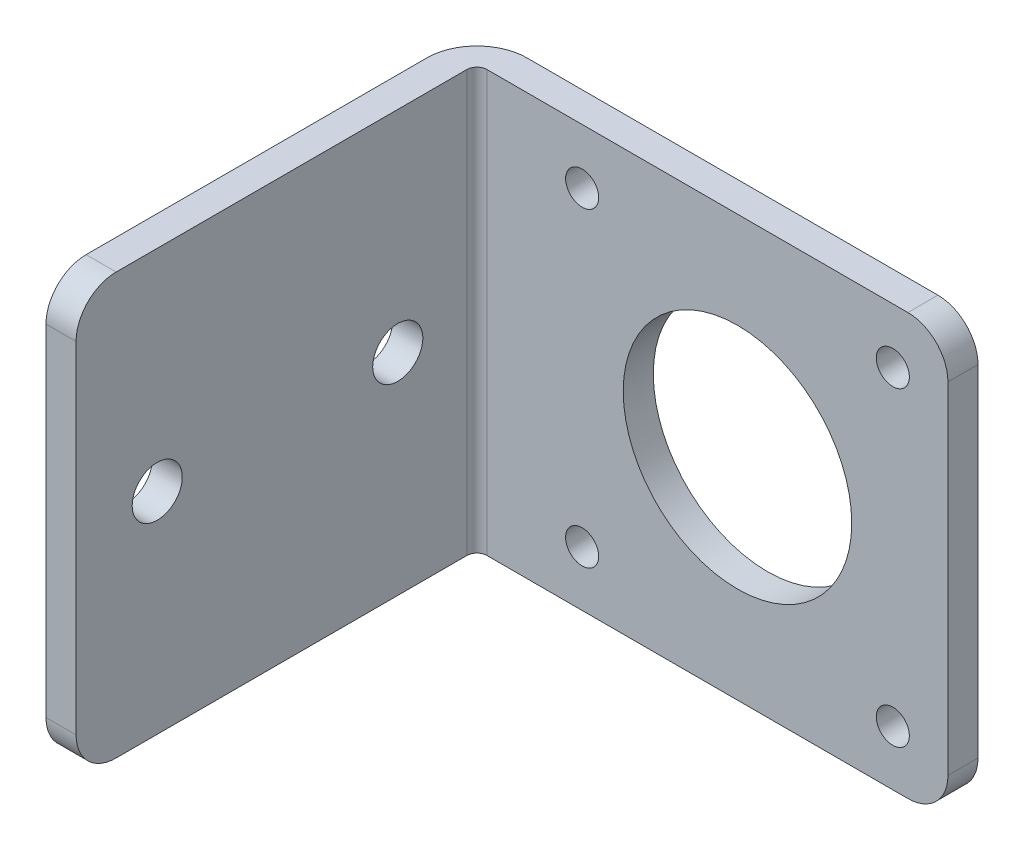
ISO-10303-21;
HEADER;
FILE_DESCRIPTION(('STEP AP214'),'2;1');
FILE_NAME('part.step','',(''),(''),'','','');
FILE_SCHEMA(('AUTOMOTIVE_DESIGN { 1 0 10303 214 1 1 1 1 }'));
ENDSEC;
DATA;
#1=APPLICATION_CONTEXT('core data for automotive mechanical design processes');
#2=APPLICATION_PROTOCOL_DEFINITION('international standard','automotive_design',2000,#1);
#3=PRODUCT_CONTEXT('',#1,'mechanical');
#4=PRODUCT('Part','Part','',(#3));
#5=PRODUCT_RELATED_PRODUCT_CATEGORY('part','',(#4));
#6=PRODUCT_DEFINITION_FORMATION('','',#4);
#7=PRODUCT_DEFINITION_CONTEXT('part definition',#1,'design');
#8=PRODUCT_DEFINITION('design','',#6,#7);
#9=PRODUCT_DEFINITION_SHAPE('','',#8);
#10=(LENGTH_UNIT() NAMED_UNIT(*) SI_UNIT(.MILLI.,.METRE.));
#11=(NAMED_UNIT(*) PLANE_ANGLE_UNIT() SI_UNIT($,.RADIAN.));
#12=(NAMED_UNIT(*) SI_UNIT($,.STERADIAN.) SOLID_ANGLE_UNIT());
#13=UNCERTAINTY_MEASURE_WITH_UNIT(LENGTH_MEASURE(1.E-05),#10,'distance_accuracy_value','');
#14=(GEOMETRIC_REPRESENTATION_CONTEXT(3) GLOBAL_UNCERTAINTY_ASSIGNED_CONTEXT((#13)) GLOBAL_UNIT_ASSIGNED_CONTEXT((#10,
#11,#12)) REPRESENTATION_CONTEXT('',''));
#15=CARTESIAN_POINT('',(0.,0.,0.));
#16=DIRECTION('',(0.,0.,1.));
#17=DIRECTION('',(1.,0.,0.));
#18=AXIS2_PLACEMENT_3D('',#15,#16,#17);
#19=CARTESIAN_POINT('',(0.,0.,34.9));
#20=DIRECTION('',(1.,0.,0.));
#21=DIRECTION('',(0.,0.,-1.));
#22=AXIS2_PLACEMENT_3D('',#19,#20,#21);
#23=CYLINDRICAL_SURFACE('',#22,2.5);
#24=CARTESIAN_POINT('',(0.,0.,34.9));
#25=DIRECTION('',(1.,0.,0.));
#26=DIRECTION('',(0.,0.,-1.));
#27=AXIS2_PLACEMENT_3D('',#24,#25,#26);
#28=CIRCLE('',#27,2.5);
#29=CARTESIAN_POINT('',(0.,0.,37.4));
#30=VERTEX_POINT('',#29);
#31=EDGE_CURVE('E40',#30,#30,#28,.T.);
#32=ORIENTED_EDGE('',*,*,#31,.F.);
#33=DIRECTION('',(1.,0.,0.));
#34=VECTOR('',#33,1.);
#35=CARTESIAN_POINT('',(0.,0.,37.4));
#36=LINE('',#35,#34);
#37=CARTESIAN_POINT('',(3.,0.,37.4));
#38=VERTEX_POINT('',#37);
#39=EDGE_CURVE('E11',#30,#38,#36,.T.);
#40=ORIENTED_EDGE('',*,*,#39,.T.);
#41=CARTESIAN_POINT('',(3.,0.,34.9));
#42=DIRECTION('',(1.,0.,0.));
#43=DIRECTION('',(0.,0.,-1.));
#44=AXIS2_PLACEMENT_3D('',#41,#42,#43);
#45=CIRCLE('',#44,2.5);
#46=EDGE_CURVE('E27',#38,#38,#45,.T.);
#47=ORIENTED_EDGE('',*,*,#46,.T.);
#48=ORIENTED_EDGE('',*,*,#39,.F.);
#49=EDGE_LOOP('',(#32,#40,#47,#48));
#50=FACE_BOUND('',#49,.T.);
#51=ADVANCED_FACE('F16',(#50),#23,.F.);
#52=CARTESIAN_POINT('',(0.,0.,10.9));
#53=DIRECTION('',(1.,0.,0.));
#54=DIRECTION('',(0.,0.,-1.));
#55=AXIS2_PLACEMENT_3D('',#52,#53,#54);
#56=CYLINDRICAL_SURFACE('',#55,2.5);
#57=CARTESIAN_POINT('',(0.,0.,10.9));
#58=DIRECTION('',(1.,0.,0.));
#59=DIRECTION('',(0.,0.,-1.));
#60=AXIS2_PLACEMENT_3D('',#57,#58,#59);
#61=CIRCLE('',#60,2.5);
#62=CARTESIAN_POINT('',(0.,0.,13.4));
#63=VERTEX_POINT('',#62);
#64=EDGE_CURVE('E142',#63,#63,#61,.T.);
#65=ORIENTED_EDGE('',*,*,#64,.F.);
#66=DIRECTION('',(1.,0.,0.));
#67=VECTOR('',#66,1.);
#68=CARTESIAN_POINT('',(0.,0.,13.4));
#69=LINE('',#68,#67);
#70=CARTESIAN_POINT('',(3.,0.,13.4));
#71=VERTEX_POINT('',#70);
#72=EDGE_CURVE('E145',#63,#71,#69,.T.);
#73=ORIENTED_EDGE('',*,*,#72,.T.);
#74=CARTESIAN_POINT('',(3.,0.,10.9));
#75=DIRECTION('',(1.,0.,0.));
#76=DIRECTION('',(0.,0.,-1.));
#77=AXIS2_PLACEMENT_3D('',#74,#75,#76);
#78=CIRCLE('',#77,2.5);
#79=EDGE_CURVE('E164',#71,#71,#78,.T.);
#80=ORIENTED_EDGE('',*,*,#79,.T.);
#81=ORIENTED_EDGE('',*,*,#72,.F.);
#82=EDGE_LOOP('',(#65,#73,#80,#81));
#83=FACE_BOUND('',#82,.T.);
#84=ADVANCED_FACE('F143',(#83),#56,.F.);
#85=CARTESIAN_POINT('',(44.5,-15.5,0.));
#86=DIRECTION('',(0.,0.,1.));
#87=DIRECTION('',(1.,0.,0.));
#88=AXIS2_PLACEMENT_3D('',#85,#86,#87);
#89=CYLINDRICAL_SURFACE('',#88,1.65);
#90=CARTESIAN_POINT('',(44.5,-15.5,0.));
#91=DIRECTION('',(0.,0.,1.));
#92=DIRECTION('',(1.,0.,0.));
#93=AXIS2_PLACEMENT_3D('',#90,#91,#92);
#94=CIRCLE('',#93,1.65);
#95=CARTESIAN_POINT('',(42.85,-15.5,0.));
#96=VERTEX_POINT('',#95);
#97=EDGE_CURVE('E253',#96,#96,#94,.T.);
#98=ORIENTED_EDGE('',*,*,#97,.F.);
#99=DIRECTION('',(0.,0.,1.));
#100=VECTOR('',#99,1.);
#101=CARTESIAN_POINT('',(42.85,-15.5,0.));
#102=LINE('',#101,#100);
#103=CARTESIAN_POINT('',(42.85,-15.5,3.));
#104=VERTEX_POINT('',#103);
#105=EDGE_CURVE('E244',#96,#104,#102,.T.);
#106=ORIENTED_EDGE('',*,*,#105,.T.);
#107=CARTESIAN_POINT('',(44.5,-15.5,3.));
#108=DIRECTION('',(0.,0.,1.));
#109=DIRECTION('',(1.,0.,0.));
#110=AXIS2_PLACEMENT_3D('',#107,#108,#109);
#111=CIRCLE('',#110,1.65);
#112=EDGE_CURVE('E248',#104,#104,#111,.T.);
#113=ORIENTED_EDGE('',*,*,#112,.T.);
#114=ORIENTED_EDGE('',*,*,#105,.F.);
#115=EDGE_LOOP('',(#98,#106,#113,#114));
#116=FACE_BOUND('',#115,.T.);
#117=ADVANCED_FACE('F492',(#116),#89,.F.);
#118=CARTESIAN_POINT('',(13.5,-15.5,0.));
#119=DIRECTION('',(0.,0.,1.));
#120=DIRECTION('',(1.,0.,0.));
#121=AXIS2_PLACEMENT_3D('',#118,#119,#120);
#122=CYLINDRICAL_SURFACE('',#121,1.65);
#123=CARTESIAN_POINT('',(13.5,-15.5,0.));
#124=DIRECTION('',(0.,0.,1.));
#125=DIRECTION('',(1.,0.,0.));
#126=AXIS2_PLACEMENT_3D('',#123,#124,#125);
#127=CIRCLE('',#126,1.65);
#128=CARTESIAN_POINT('',(11.85,-15.5,0.));
#129=VERTEX_POINT('',#128);
#130=EDGE_CURVE('E314',#129,#129,#127,.T.);
#131=ORIENTED_EDGE('',*,*,#130,.F.);
#132=DIRECTION('',(0.,0.,1.));
#133=VECTOR('',#132,1.);
#134=CARTESIAN_POINT('',(11.85,-15.5,0.));
#135=LINE('',#134,#133);
#136=CARTESIAN_POINT('',(11.85,-15.5,3.));
#137=VERTEX_POINT('',#136);
#138=EDGE_CURVE('E197',#129,#137,#135,.T.);
#139=ORIENTED_EDGE('',*,*,#138,.T.);
#140=CARTESIAN_POINT('',(13.5,-15.5,3.));
#141=DIRECTION('',(0.,0.,1.));
#142=DIRECTION('',(1.,0.,0.));
#143=AXIS2_PLACEMENT_3D('',#140,#141,#142);
#144=CIRCLE('',#143,1.65);
#145=EDGE_CURVE('E181',#137,#137,#144,.T.);
#146=ORIENTED_EDGE('',*,*,#145,.T.);
#147=ORIENTED_EDGE('',*,*,#138,.F.);
#148=EDGE_LOOP('',(#131,#139,#146,#147));
#149=FACE_BOUND('',#148,.T.);
#150=ADVANCED_FACE('F364',(#149),#122,.F.);
#151=CARTESIAN_POINT('',(44.5,15.5,0.));
#152=DIRECTION('',(0.,0.,1.));
#153=DIRECTION('',(1.,0.,0.));
#154=AXIS2_PLACEMENT_3D('',#151,#152,#153);
#155=CYLINDRICAL_SURFACE('',#154,1.65);
#156=CARTESIAN_POINT('',(44.5,15.5,0.));
#157=DIRECTION('',(0.,0.,1.));
#158=DIRECTION('',(1.,0.,0.));
#159=AXIS2_PLACEMENT_3D('',#156,#157,#158);
#160=CIRCLE('',#159,1.65);
#161=CARTESIAN_POINT('',(42.85,15.5,0.));
#162=VERTEX_POINT('',#161);
#163=EDGE_CURVE('E227',#162,#162,#160,.T.);
#164=ORIENTED_EDGE('',*,*,#163,.F.);
#165=DIRECTION('',(0.,0.,1.));
#166=VECTOR('',#165,1.);
#167=CARTESIAN_POINT('',(42.85,15.5,0.));
#168=LINE('',#167,#166);
#169=CARTESIAN_POINT('',(42.85,15.5,3.));
#170=VERTEX_POINT('',#169);
#171=EDGE_CURVE('E177',#162,#170,#168,.T.);
#172=ORIENTED_EDGE('',*,*,#171,.T.);
#173=CARTESIAN_POINT('',(44.5,15.5,3.));
#174=DIRECTION('',(0.,0.,1.));
#175=DIRECTION('',(1.,0.,0.));
#176=AXIS2_PLACEMENT_3D('',#173,#174,#175);
#177=CIRCLE('',#176,1.65);
#178=EDGE_CURVE('E182',#170,#170,#177,.T.);
#179=ORIENTED_EDGE('',*,*,#178,.T.);
#180=ORIENTED_EDGE('',*,*,#171,.F.);
#181=EDGE_LOOP('',(#164,#172,#179,#180));
#182=FACE_BOUND('',#181,.T.);
#183=ADVANCED_FACE('F512',(#182),#155,.F.);
#184=CARTESIAN_POINT('',(13.5,15.5,0.));
#185=DIRECTION('',(0.,0.,1.));
#186=DIRECTION('',(1.,0.,0.));
#187=AXIS2_PLACEMENT_3D('',#184,#185,#186);
#188=CYLINDRICAL_SURFACE('',#187,1.65);
#189=CARTESIAN_POINT('',(13.5,15.5,0.));
#190=DIRECTION('',(0.,0.,1.));
#191=DIRECTION('',(1.,0.,0.));
#192=AXIS2_PLACEMENT_3D('',#189,#190,#191);
#193=CIRCLE('',#192,1.65);
#194=CARTESIAN_POINT('',(11.85,15.5,0.));
#195=VERTEX_POINT('',#194);
#196=EDGE_CURVE('E187',#195,#195,#193,.T.);
#197=ORIENTED_EDGE('',*,*,#196,.F.);
#198=DIRECTION('',(0.,0.,1.));
#199=VECTOR('',#198,1.);
#200=CARTESIAN_POINT('',(11.85,15.5,0.));
#201=LINE('',#200,#199);
#202=CARTESIAN_POINT('',(11.85,15.5,3.));
#203=VERTEX_POINT('',#202);
#204=EDGE_CURVE('E280',#195,#203,#201,.T.);
#205=ORIENTED_EDGE('',*,*,#204,.T.);
#206=CARTESIAN_POINT('',(13.5,15.5,3.));
#207=DIRECTION('',(0.,0.,1.));
#208=DIRECTION('',(1.,0.,0.));
#209=AXIS2_PLACEMENT_3D('',#206,#207,#208);
#210=CIRCLE('',#209,1.65);
#211=EDGE_CURVE('E276',#203,#203,#210,.T.);
#212=ORIENTED_EDGE('',*,*,#211,.T.);
#213=ORIENTED_EDGE('',*,*,#204,.F.);
#214=EDGE_LOOP('',(#197,#205,#212,#213));
#215=FACE_BOUND('',#214,.T.);
#216=ADVANCED_FACE('F514',(#215),#188,.F.);
#217=CARTESIAN_POINT('',(29.,0.,0.));
#218=DIRECTION('',(0.,0.,1.));
#219=DIRECTION('',(1.,0.,0.));
#220=AXIS2_PLACEMENT_3D('',#217,#218,#219);
#221=CYLINDRICAL_SURFACE('',#220,11.4);
#222=CARTESIAN_POINT('',(29.,0.,0.));
#223=DIRECTION('',(0.,0.,1.));
#224=DIRECTION('',(1.,0.,0.));
#225=AXIS2_PLACEMENT_3D('',#222,#223,#224);
#226=CIRCLE('',#225,11.4);
#227=CARTESIAN_POINT('',(17.6,0.,0.));
#228=VERTEX_POINT('',#227);
#229=EDGE_CURVE('E183',#228,#228,#226,.T.);
#230=ORIENTED_EDGE('',*,*,#229,.F.);
#231=DIRECTION('',(0.,0.,1.));
#232=VECTOR('',#231,1.);
#233=CARTESIAN_POINT('',(17.6,0.,0.));
#234=LINE('',#233,#232);
#235=CARTESIAN_POINT('',(17.6,0.,3.));
#236=VERTEX_POINT('',#235);
#237=EDGE_CURVE('E207',#228,#236,#234,.T.);
#238=ORIENTED_EDGE('',*,*,#237,.T.);
#239=CARTESIAN_POINT('',(29.,0.,3.));
#240=DIRECTION('',(0.,0.,1.));
#241=DIRECTION('',(1.,0.,0.));
#242=AXIS2_PLACEMENT_3D('',#239,#240,#241);
#243=CIRCLE('',#242,11.4);
#244=EDGE_CURVE('E203',#236,#236,#243,.T.);
#245=ORIENTED_EDGE('',*,*,#244,.T.);
#246=ORIENTED_EDGE('',*,*,#237,.F.);
#247=EDGE_LOOP('',(#230,#238,#245,#246));
#248=FACE_BOUND('',#247,.T.);
#249=ADVANCED_FACE('F18',(#248),#221,.F.);
#250=CARTESIAN_POINT('',(0.,21.,3.));
#251=DIRECTION('',(0.,0.,-1.));
#252=DIRECTION('',(0.,-1.,0.));
#253=AXIS2_PLACEMENT_3D('',#250,#251,#252);
#254=PLANE('',#253);
#255=DIRECTION('',(1.,0.,0.));
#256=VECTOR('',#255,1.);
#257=CARTESIAN_POINT('',(0.,21.,3.));
#258=LINE('',#257,#256);
#259=CARTESIAN_POINT('',(4.,21.,3.));
#260=VERTEX_POINT('',#259);
#261=CARTESIAN_POINT('',(46.,21.,3.));
#262=VERTEX_POINT('',#261);
#263=EDGE_CURVE('E313',#260,#262,#258,.T.);
#264=ORIENTED_EDGE('',*,*,#263,.F.);
#265=DIRECTION('',(0.,-1.,0.));
#266=VECTOR('',#265,1.);
#267=CARTESIAN_POINT('',(4.,-21.,3.));
#268=LINE('',#267,#266);
#269=CARTESIAN_POINT('',(4.,-21.,3.));
#270=VERTEX_POINT('',#269);
#271=EDGE_CURVE('E208',#260,#270,#268,.T.);
#272=ORIENTED_EDGE('',*,*,#271,.T.);
#273=DIRECTION('',(1.,0.,0.));
#274=VECTOR('',#273,1.);
#275=CARTESIAN_POINT('',(0.,-21.,3.));
#276=LINE('',#275,#274);
#277=CARTESIAN_POINT('',(46.,-21.,3.));
#278=VERTEX_POINT('',#277);
#279=EDGE_CURVE('E238',#270,#278,#276,.T.);
#280=ORIENTED_EDGE('',*,*,#279,.T.);
#281=CARTESIAN_POINT('',(46.,-17.,3.));
#282=DIRECTION('',(0.,0.,1.));
#283=DIRECTION('',(-1.,0.,0.));
#284=AXIS2_PLACEMENT_3D('',#281,#282,#283);
#285=CIRCLE('',#284,4.);
#286=CARTESIAN_POINT('',(50.,-17.,3.));
#287=VERTEX_POINT('',#286);
#288=EDGE_CURVE('E243',#278,#287,#285,.T.);
#289=ORIENTED_EDGE('',*,*,#288,.T.);
#290=DIRECTION('',(0.,-1.,0.));
#291=VECTOR('',#290,1.);
#292=CARTESIAN_POINT('',(50.,21.,3.));
#293=LINE('',#292,#291);
#294=CARTESIAN_POINT('',(50.,17.,3.));
#295=VERTEX_POINT('',#294);
#296=EDGE_CURVE('E213',#295,#287,#293,.T.);
#297=ORIENTED_EDGE('',*,*,#296,.F.);
#298=CARTESIAN_POINT('',(46.,17.,3.));
#299=DIRECTION('',(0.,0.,1.));
#300=DIRECTION('',(-1.,0.,0.));
#301=AXIS2_PLACEMENT_3D('',#298,#299,#300);
#302=CIRCLE('',#301,4.);
#303=EDGE_CURVE('E239',#295,#262,#302,.T.);
#304=ORIENTED_EDGE('',*,*,#303,.T.);
#305=EDGE_LOOP('',(#264,#272,#280,#289,#297,#304));
#306=FACE_BOUND('',#305,.T.);
#307=ORIENTED_EDGE('',*,*,#112,.F.);
#308=EDGE_LOOP('',(#307));
#309=FACE_BOUND('',#308,.T.);
#310=ORIENTED_EDGE('',*,*,#145,.F.);
#311=EDGE_LOOP('',(#310));
#312=FACE_BOUND('',#311,.T.);
#313=ORIENTED_EDGE('',*,*,#178,.F.);
#314=EDGE_LOOP('',(#313));
#315=FACE_BOUND('',#314,.T.);
#316=ORIENTED_EDGE('',*,*,#211,.F.);
#317=EDGE_LOOP('',(#316));
#318=FACE_BOUND('',#317,.T.);
#319=ORIENTED_EDGE('',*,*,#244,.F.);
#320=EDGE_LOOP('',(#319));
#321=FACE_BOUND('',#320,.T.);
#322=ADVANCED_FACE('F470',(#306,#309,#312,#315,#318,#321),#254,.F.);
#323=CARTESIAN_POINT('',(50.,21.,0.));
#324=DIRECTION('',(1.,0.,0.));
#325=DIRECTION('',(0.,1.,0.));
#326=AXIS2_PLACEMENT_3D('',#323,#324,#325);
#327=PLANE('',#326);
#328=ORIENTED_EDGE('',*,*,#296,.T.);
#329=DIRECTION('',(0.,0.,-1.));
#330=VECTOR('',#329,1.);
#331=CARTESIAN_POINT('',(50.,-17.,0.));
#332=LINE('',#331,#330);
#333=CARTESIAN_POINT('',(50.,-17.,0.));
#334=VERTEX_POINT('',#333);
#335=EDGE_CURVE('E209',#287,#334,#332,.T.);
#336=ORIENTED_EDGE('',*,*,#335,.T.);
#337=DIRECTION('',(0.,-1.,0.));
#338=VECTOR('',#337,1.);
#339=CARTESIAN_POINT('',(50.,21.,0.));
#340=LINE('',#339,#338);
#341=CARTESIAN_POINT('',(50.,17.,0.));
#342=VERTEX_POINT('',#341);
#343=EDGE_CURVE('E252',#342,#334,#340,.T.);
#344=ORIENTED_EDGE('',*,*,#343,.F.);
#345=DIRECTION('',(0.,0.,1.));
#346=VECTOR('',#345,1.);
#347=CARTESIAN_POINT('',(50.,17.,3.));
#348=LINE('',#347,#346);
#349=EDGE_CURVE('E20',#342,#295,#348,.T.);
#350=ORIENTED_EDGE('',*,*,#349,.T.);
#351=EDGE_LOOP('',(#328,#336,#344,#350));
#352=FACE_BOUND('',#351,.T.);
#353=ADVANCED_FACE('F370',(#352),#327,.T.);
#354=CARTESIAN_POINT('',(0.,21.,0.));
#355=DIRECTION('',(0.,0.,-1.));
#356=DIRECTION('',(0.,-1.,0.));
#357=AXIS2_PLACEMENT_3D('',#354,#355,#356);
#358=PLANE('',#357);
#359=DIRECTION('',(1.,0.,0.));
#360=VECTOR('',#359,1.);
#361=CARTESIAN_POINT('',(0.,-21.,0.));
#362=LINE('',#361,#360);
#363=CARTESIAN_POINT('',(5.,-21.,0.));
#364=VERTEX_POINT('',#363);
#365=CARTESIAN_POINT('',(46.,-21.,0.));
#366=VERTEX_POINT('',#365);
#367=EDGE_CURVE('E202',#364,#366,#362,.T.);
#368=ORIENTED_EDGE('',*,*,#367,.F.);
#369=DIRECTION('',(0.,1.,0.));
#370=VECTOR('',#369,1.);
#371=CARTESIAN_POINT('',(5.,21.,0.));
#372=LINE('',#371,#370);
#373=CARTESIAN_POINT('',(5.,21.,0.));
#374=VERTEX_POINT('',#373);
#375=EDGE_CURVE('E219',#364,#374,#372,.T.);
#376=ORIENTED_EDGE('',*,*,#375,.T.);
#377=DIRECTION('',(1.,0.,0.));
#378=VECTOR('',#377,1.);
#379=CARTESIAN_POINT('',(0.,21.,0.));
#380=LINE('',#379,#378);
#381=CARTESIAN_POINT('',(46.,21.,0.));
#382=VERTEX_POINT('',#381);
#383=EDGE_CURVE('E223',#374,#382,#380,.T.);
#384=ORIENTED_EDGE('',*,*,#383,.T.);
#385=CARTESIAN_POINT('',(46.,17.,0.));
#386=DIRECTION('',(0.,0.,-1.));
#387=DIRECTION('',(-1.,0.,0.));
#388=AXIS2_PLACEMENT_3D('',#385,#386,#387);
#389=CIRCLE('',#388,4.);
#390=EDGE_CURVE('E336',#382,#342,#389,.T.);
#391=ORIENTED_EDGE('',*,*,#390,.T.);
#392=ORIENTED_EDGE('',*,*,#343,.T.);
#393=CARTESIAN_POINT('',(46.,-17.,0.));
#394=DIRECTION('',(0.,0.,-1.));
#395=DIRECTION('',(-1.,0.,0.));
#396=AXIS2_PLACEMENT_3D('',#393,#394,#395);
#397=CIRCLE('',#396,4.);
#398=EDGE_CURVE('E249',#334,#366,#397,.T.);
#399=ORIENTED_EDGE('',*,*,#398,.T.);
#400=EDGE_LOOP('',(#368,#376,#384,#391,#392,#399));
#401=FACE_BOUND('',#400,.T.);
#402=ORIENTED_EDGE('',*,*,#97,.T.);
#403=EDGE_LOOP('',(#402));
#404=FACE_BOUND('',#403,.T.);
#405=ORIENTED_EDGE('',*,*,#130,.T.);
#406=EDGE_LOOP('',(#405));
#407=FACE_BOUND('',#406,.T.);
#408=ORIENTED_EDGE('',*,*,#163,.T.);
#409=EDGE_LOOP('',(#408));
#410=FACE_BOUND('',#409,.T.);
#411=ORIENTED_EDGE('',*,*,#196,.T.);
#412=EDGE_LOOP('',(#411));
#413=FACE_BOUND('',#412,.T.);
#414=ORIENTED_EDGE('',*,*,#229,.T.);
#415=EDGE_LOOP('',(#414));
#416=FACE_BOUND('',#415,.T.);
#417=ADVANCED_FACE('F366',(#401,#404,#407,#410,#413,#416),#358,.T.);
#418=CARTESIAN_POINT('',(0.,21.,43.));
#419=DIRECTION('',(-1.,0.,0.));
#420=DIRECTION('',(0.,0.,1.));
#421=AXIS2_PLACEMENT_3D('',#418,#419,#420);
#422=PLANE('',#421);
#423=DIRECTION('',(0.,0.,-1.));
#424=VECTOR('',#423,1.);
#425=CARTESIAN_POINT('',(0.,21.,43.));
#426=LINE('',#425,#424);
#427=CARTESIAN_POINT('',(0.,21.,39.));
#428=VERTEX_POINT('',#427);
#429=CARTESIAN_POINT('',(0.,21.,5.));
#430=VERTEX_POINT('',#429);
#431=EDGE_CURVE('E188',#428,#430,#426,.T.);
#432=ORIENTED_EDGE('',*,*,#431,.T.);
#433=DIRECTION('',(0.,-1.,0.));
#434=VECTOR('',#433,1.);
#435=CARTESIAN_POINT('',(0.,21.,5.));
#436=LINE('',#435,#434);
#437=CARTESIAN_POINT('',(0.,-21.,5.));
#438=VERTEX_POINT('',#437);
#439=EDGE_CURVE('E288',#430,#438,#436,.T.);
#440=ORIENTED_EDGE('',*,*,#439,.T.);
#441=DIRECTION('',(0.,0.,-1.));
#442=VECTOR('',#441,1.);
#443=CARTESIAN_POINT('',(0.,-21.,43.));
#444=LINE('',#443,#442);
#445=CARTESIAN_POINT('',(0.,-21.,39.));
#446=VERTEX_POINT('',#445);
#447=EDGE_CURVE('E262',#446,#438,#444,.T.);
#448=ORIENTED_EDGE('',*,*,#447,.F.);
#449=CARTESIAN_POINT('',(0.,-17.,39.));
#450=DIRECTION('',(-1.,0.,0.));
#451=DIRECTION('',(0.,0.,1.));
#452=AXIS2_PLACEMENT_3D('',#449,#450,#451);
#453=CIRCLE('',#452,4.);
#454=CARTESIAN_POINT('',(0.,-17.,43.));
#455=VERTEX_POINT('',#454);
#456=EDGE_CURVE('E167',#446,#455,#453,.T.);
#457=ORIENTED_EDGE('',*,*,#456,.T.);
#458=DIRECTION('',(0.,-1.,0.));
#459=VECTOR('',#458,1.);
#460=CARTESIAN_POINT('',(0.,21.,43.));
#461=LINE('',#460,#459);
#462=CARTESIAN_POINT('',(0.,17.,43.));
#463=VERTEX_POINT('',#462);
#464=EDGE_CURVE('E148',#463,#455,#461,.T.);
#465=ORIENTED_EDGE('',*,*,#464,.F.);
#466=CARTESIAN_POINT('',(0.,17.,39.));
#467=DIRECTION('',(-1.,0.,0.));
#468=DIRECTION('',(0.,0.,1.));
#469=AXIS2_PLACEMENT_3D('',#466,#467,#468);
#470=CIRCLE('',#469,4.);
#471=EDGE_CURVE('E155',#463,#428,#470,.T.);
#472=ORIENTED_EDGE('',*,*,#471,.T.);
#473=EDGE_LOOP('',(#432,#440,#448,#457,#465,#472));
#474=FACE_BOUND('',#473,.T.);
#475=ORIENTED_EDGE('',*,*,#31,.T.);
#476=EDGE_LOOP('',(#475));
#477=FACE_BOUND('',#476,.T.);
#478=ORIENTED_EDGE('',*,*,#64,.T.);
#479=EDGE_LOOP('',(#478));
#480=FACE_BOUND('',#479,.T.);
#481=ADVANCED_FACE('F369',(#474,#477,#480),#422,.T.);
#482=CARTESIAN_POINT('',(3.,21.,43.));
#483=DIRECTION('',(0.,0.,1.));
#484=DIRECTION('',(1.,0.,0.));
#485=AXIS2_PLACEMENT_3D('',#482,#483,#484);
#486=PLANE('',#485);
#487=ORIENTED_EDGE('',*,*,#464,.T.);
#488=DIRECTION('',(1.,0.,0.));
#489=VECTOR('',#488,1.);
#490=CARTESIAN_POINT('',(3.,-17.,43.));
#491=LINE('',#490,#489);
#492=CARTESIAN_POINT('',(3.,-17.,43.));
#493=VERTEX_POINT('',#492);
#494=EDGE_CURVE('E158',#455,#493,#491,.T.);
#495=ORIENTED_EDGE('',*,*,#494,.T.);
#496=DIRECTION('',(0.,-1.,0.));
#497=VECTOR('',#496,1.);
#498=CARTESIAN_POINT('',(3.,21.,43.));
#499=LINE('',#498,#497);
#500=CARTESIAN_POINT('',(3.,17.,43.));
#501=VERTEX_POINT('',#500);
#502=EDGE_CURVE('E175',#501,#493,#499,.T.);
#503=ORIENTED_EDGE('',*,*,#502,.F.);
#504=DIRECTION('',(-1.,0.,0.));
#505=VECTOR('',#504,1.);
#506=CARTESIAN_POINT('',(0.,17.,43.));
#507=LINE('',#506,#505);
#508=EDGE_CURVE('E171',#501,#463,#507,.T.);
#509=ORIENTED_EDGE('',*,*,#508,.T.);
#510=EDGE_LOOP('',(#487,#495,#503,#509));
#511=FACE_BOUND('',#510,.T.);
#512=ADVANCED_FACE('F453',(#511),#486,.T.);
#513=CARTESIAN_POINT('',(3.,21.,43.));
#514=DIRECTION('',(-1.,0.,0.));
#515=DIRECTION('',(0.,0.,1.));
#516=AXIS2_PLACEMENT_3D('',#513,#514,#515);
#517=PLANE('',#516);
#518=DIRECTION('',(0.,0.,-1.));
#519=VECTOR('',#518,1.);
#520=CARTESIAN_POINT('',(3.,-21.,43.));
#521=LINE('',#520,#519);
#522=CARTESIAN_POINT('',(3.,-21.,39.));
#523=VERTEX_POINT('',#522);
#524=CARTESIAN_POINT('',(3.,-21.,4.));
#525=VERTEX_POINT('',#524);
#526=EDGE_CURVE('E214',#523,#525,#521,.T.);
#527=ORIENTED_EDGE('',*,*,#526,.T.);
#528=DIRECTION('',(0.,1.,0.));
#529=VECTOR('',#528,1.);
#530=CARTESIAN_POINT('',(3.,21.,4.));
#531=LINE('',#530,#529);
#532=CARTESIAN_POINT('',(3.,21.,4.));
#533=VERTEX_POINT('',#532);
#534=EDGE_CURVE('E218',#525,#533,#531,.T.);
#535=ORIENTED_EDGE('',*,*,#534,.T.);
#536=DIRECTION('',(0.,0.,-1.));
#537=VECTOR('',#536,1.);
#538=CARTESIAN_POINT('',(3.,21.,43.));
#539=LINE('',#538,#537);
#540=CARTESIAN_POINT('',(3.,21.,39.));
#541=VERTEX_POINT('',#540);
#542=EDGE_CURVE('E301',#541,#533,#539,.T.);
#543=ORIENTED_EDGE('',*,*,#542,.F.);
#544=CARTESIAN_POINT('',(3.,17.,39.));
#545=DIRECTION('',(1.,0.,0.));
#546=DIRECTION('',(0.,0.,1.));
#547=AXIS2_PLACEMENT_3D('',#544,#545,#546);
#548=CIRCLE('',#547,4.);
#549=EDGE_CURVE('E287',#541,#501,#548,.T.);
#550=ORIENTED_EDGE('',*,*,#549,.T.);
#551=ORIENTED_EDGE('',*,*,#502,.T.);
#552=CARTESIAN_POINT('',(3.,-17.,39.));
#553=DIRECTION('',(1.,0.,0.));
#554=DIRECTION('',(0.,0.,1.));
#555=AXIS2_PLACEMENT_3D('',#552,#553,#554);
#556=CIRCLE('',#555,4.);
#557=EDGE_CURVE('E172',#493,#523,#556,.T.);
#558=ORIENTED_EDGE('',*,*,#557,.T.);
#559=EDGE_LOOP('',(#527,#535,#543,#550,#551,#558));
#560=FACE_BOUND('',#559,.T.);
#561=ORIENTED_EDGE('',*,*,#46,.F.);
#562=EDGE_LOOP('',(#561));
#563=FACE_BOUND('',#562,.T.);
#564=ORIENTED_EDGE('',*,*,#79,.F.);
#565=EDGE_LOOP('',(#564));
#566=FACE_BOUND('',#565,.T.);
#567=ADVANCED_FACE('F447',(#560,#563,#566),#517,.F.);
#568=CARTESIAN_POINT('',(0.,21.,0.));
#569=DIRECTION('',(0.,-1.,0.));
#570=DIRECTION('',(0.,0.,-1.));
#571=AXIS2_PLACEMENT_3D('',#568,#569,#570);
#572=PLANE('',#571);
#573=ORIENTED_EDGE('',*,*,#383,.F.);
#574=CARTESIAN_POINT('',(5.,21.,5.));
#575=DIRECTION('',(0.,1.,0.));
#576=DIRECTION('',(0.,0.,-1.));
#577=AXIS2_PLACEMENT_3D('',#574,#575,#576);
#578=CIRCLE('',#577,5.);
#579=EDGE_CURVE('E176',#374,#430,#578,.T.);
#580=ORIENTED_EDGE('',*,*,#579,.T.);
#581=ORIENTED_EDGE('',*,*,#431,.F.);
#582=DIRECTION('',(1.,0.,0.));
#583=VECTOR('',#582,1.);
#584=CARTESIAN_POINT('',(3.,21.,39.));
#585=LINE('',#584,#583);
#586=EDGE_CURVE('E234',#428,#541,#585,.T.);
#587=ORIENTED_EDGE('',*,*,#586,.T.);
#588=ORIENTED_EDGE('',*,*,#542,.T.);
#589=CARTESIAN_POINT('',(4.,21.,4.));
#590=DIRECTION('',(0.,-1.,0.));
#591=DIRECTION('',(0.,0.,-1.));
#592=AXIS2_PLACEMENT_3D('',#589,#590,#591);
#593=CIRCLE('',#592,1.);
#594=EDGE_CURVE('E304',#533,#260,#593,.T.);
#595=ORIENTED_EDGE('',*,*,#594,.T.);
#596=ORIENTED_EDGE('',*,*,#263,.T.);
#597=DIRECTION('',(0.,0.,-1.));
#598=VECTOR('',#597,1.);
#599=CARTESIAN_POINT('',(46.,21.,0.));
#600=LINE('',#599,#598);
#601=EDGE_CURVE('E269',#262,#382,#600,.T.);
#602=ORIENTED_EDGE('',*,*,#601,.T.);
#603=EDGE_LOOP('',(#573,#580,#581,#587,#588,#595,#596,#602));
#604=FACE_BOUND('',#603,.T.);
#605=ADVANCED_FACE('F459',(#604),#572,.F.);
#606=CARTESIAN_POINT('',(0.,-21.,0.));
#607=DIRECTION('',(0.,-1.,0.));
#608=DIRECTION('',(0.,0.,-1.));
#609=AXIS2_PLACEMENT_3D('',#606,#607,#608);
#610=PLANE('',#609);
#611=ORIENTED_EDGE('',*,*,#447,.T.);
#612=CARTESIAN_POINT('',(5.,-21.,5.));
#613=DIRECTION('',(0.,-1.,0.));
#614=DIRECTION('',(0.,0.,-1.));
#615=AXIS2_PLACEMENT_3D('',#612,#613,#614);
#616=CIRCLE('',#615,5.);
#617=EDGE_CURVE('E256',#438,#364,#616,.T.);
#618=ORIENTED_EDGE('',*,*,#617,.T.);
#619=ORIENTED_EDGE('',*,*,#367,.T.);
#620=DIRECTION('',(0.,0.,1.));
#621=VECTOR('',#620,1.);
#622=CARTESIAN_POINT('',(46.,-21.,0.));
#623=LINE('',#622,#621);
#624=EDGE_CURVE('E198',#366,#278,#623,.T.);
#625=ORIENTED_EDGE('',*,*,#624,.T.);
#626=ORIENTED_EDGE('',*,*,#279,.F.);
#627=CARTESIAN_POINT('',(4.,-21.,4.));
#628=DIRECTION('',(0.,1.,0.));
#629=DIRECTION('',(0.,0.,-1.));
#630=AXIS2_PLACEMENT_3D('',#627,#628,#629);
#631=CIRCLE('',#630,1.);
#632=EDGE_CURVE('E193',#270,#525,#631,.T.);
#633=ORIENTED_EDGE('',*,*,#632,.T.);
#634=ORIENTED_EDGE('',*,*,#526,.F.);
#635=DIRECTION('',(-1.,0.,0.));
#636=VECTOR('',#635,1.);
#637=CARTESIAN_POINT('',(0.,-21.,39.));
#638=LINE('',#637,#636);
#639=EDGE_CURVE('E189',#523,#446,#638,.T.);
#640=ORIENTED_EDGE('',*,*,#639,.T.);
#641=EDGE_LOOP('',(#611,#618,#619,#625,#626,#633,#634,#640));
#642=FACE_BOUND('',#641,.T.);
#643=ADVANCED_FACE('F444',(#642),#610,.T.);
#644=CARTESIAN_POINT('',(46.,-17.,0.));
#645=DIRECTION('',(0.,0.,1.));
#646=DIRECTION('',(1.,0.,0.));
#647=AXIS2_PLACEMENT_3D('',#644,#645,#646);
#648=CYLINDRICAL_SURFACE('',#647,4.);
#649=ORIENTED_EDGE('',*,*,#398,.F.);
#650=ORIENTED_EDGE('',*,*,#335,.F.);
#651=ORIENTED_EDGE('',*,*,#288,.F.);
#652=ORIENTED_EDGE('',*,*,#624,.F.);
#653=EDGE_LOOP('',(#649,#650,#651,#652));
#654=FACE_BOUND('',#653,.T.);
#655=ADVANCED_FACE('F469',(#654),#648,.T.);
#656=CARTESIAN_POINT('',(46.,17.,0.));
#657=DIRECTION('',(0.,0.,-1.));
#658=DIRECTION('',(-1.,0.,0.));
#659=AXIS2_PLACEMENT_3D('',#656,#657,#658);
#660=CYLINDRICAL_SURFACE('',#659,4.);
#661=ORIENTED_EDGE('',*,*,#390,.F.);
#662=ORIENTED_EDGE('',*,*,#601,.F.);
#663=ORIENTED_EDGE('',*,*,#303,.F.);
#664=ORIENTED_EDGE('',*,*,#349,.F.);
#665=EDGE_LOOP('',(#661,#662,#663,#664));
#666=FACE_BOUND('',#665,.T.);
#667=ADVANCED_FACE('F476',(#666),#660,.T.);
#668=CARTESIAN_POINT('',(0.,-17.,39.));
#669=DIRECTION('',(-1.,0.,0.));
#670=DIRECTION('',(0.,0.,1.));
#671=AXIS2_PLACEMENT_3D('',#668,#669,#670);
#672=CYLINDRICAL_SURFACE('',#671,4.);
#673=ORIENTED_EDGE('',*,*,#557,.F.);
#674=ORIENTED_EDGE('',*,*,#494,.F.);
#675=ORIENTED_EDGE('',*,*,#456,.F.);
#676=ORIENTED_EDGE('',*,*,#639,.F.);
#677=EDGE_LOOP('',(#673,#674,#675,#676));
#678=FACE_BOUND('',#677,.T.);
#679=ADVANCED_FACE('F442',(#678),#672,.T.);
#680=CARTESIAN_POINT('',(3.,17.,39.));
#681=DIRECTION('',(1.,0.,0.));
#682=DIRECTION('',(0.,0.,-1.));
#683=AXIS2_PLACEMENT_3D('',#680,#681,#682);
#684=CYLINDRICAL_SURFACE('',#683,4.);
#685=ORIENTED_EDGE('',*,*,#549,.F.);
#686=ORIENTED_EDGE('',*,*,#586,.F.);
#687=ORIENTED_EDGE('',*,*,#471,.F.);
#688=ORIENTED_EDGE('',*,*,#508,.F.);
#689=EDGE_LOOP('',(#685,#686,#687,#688));
#690=FACE_BOUND('',#689,.T.);
#691=ADVANCED_FACE('F458',(#690),#684,.T.);
#692=CARTESIAN_POINT('',(5.,21.,5.));
#693=DIRECTION('',(0.,-1.,0.));
#694=DIRECTION('',(0.,0.,-1.));
#695=AXIS2_PLACEMENT_3D('',#692,#693,#694);
#696=CYLINDRICAL_SURFACE('',#695,5.);
#697=ORIENTED_EDGE('',*,*,#579,.F.);
#698=ORIENTED_EDGE('',*,*,#375,.F.);
#699=ORIENTED_EDGE('',*,*,#617,.F.);
#700=ORIENTED_EDGE('',*,*,#439,.F.);
#701=EDGE_LOOP('',(#697,#698,#699,#700));
#702=FACE_BOUND('',#701,.T.);
#703=ADVANCED_FACE('F463',(#702),#696,.T.);
#704=CARTESIAN_POINT('',(4.,21.,4.));
#705=DIRECTION('',(0.,1.,0.));
#706=DIRECTION('',(0.,0.,1.));
#707=AXIS2_PLACEMENT_3D('',#704,#705,#706);
#708=CYLINDRICAL_SURFACE('',#707,1.);
#709=ORIENTED_EDGE('',*,*,#594,.F.);
#710=ORIENTED_EDGE('',*,*,#534,.F.);
#711=ORIENTED_EDGE('',*,*,#632,.F.);
#712=ORIENTED_EDGE('',*,*,#271,.F.);
#713=EDGE_LOOP('',(#709,#710,#711,#712));
#714=FACE_BOUND('',#713,.T.);
#715=ADVANCED_FACE('F473',(#714),#708,.F.);
#716=CLOSED_SHELL('',(#51,#84,#117,#150,#183,#216,#249,#322,#353,#417,#481,#512,#567,#605,#643,
#655,#667,#679,#691,#703,#715));
#717=MANIFOLD_SOLID_BREP('B1',#716);
#718=ADVANCED_BREP_SHAPE_REPRESENTATION('',(#18,#717),#14);
#719=SHAPE_DEFINITION_REPRESENTATION(#9,#718);
ENDSEC;
END-ISO-10303-21;
